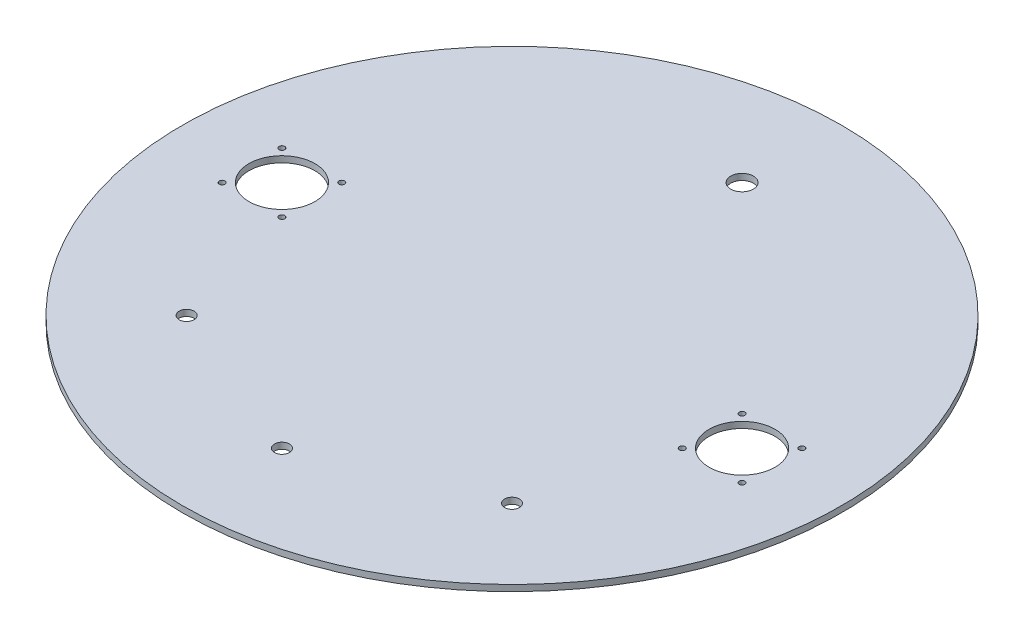
ISO-10303-21;
HEADER;
FILE_DESCRIPTION(('STEP AP214'),'2;1');
FILE_NAME('part.step','',(''),(''),'','','');
FILE_SCHEMA(('AUTOMOTIVE_DESIGN { 1 0 10303 214 1 1 1 1 }'));
ENDSEC;
DATA;
#1=APPLICATION_CONTEXT('core data for automotive mechanical design processes');
#2=APPLICATION_PROTOCOL_DEFINITION('international standard','automotive_design',2000,#1);
#3=PRODUCT_CONTEXT('',#1,'mechanical');
#4=PRODUCT('Part','Part','',(#3));
#5=PRODUCT_RELATED_PRODUCT_CATEGORY('part','',(#4));
#6=PRODUCT_DEFINITION_FORMATION('','',#4);
#7=PRODUCT_DEFINITION_CONTEXT('part definition',#1,'design');
#8=PRODUCT_DEFINITION('design','',#6,#7);
#9=PRODUCT_DEFINITION_SHAPE('','',#8);
#10=(LENGTH_UNIT() NAMED_UNIT(*) SI_UNIT(.MILLI.,.METRE.));
#11=(NAMED_UNIT(*) PLANE_ANGLE_UNIT() SI_UNIT($,.RADIAN.));
#12=(NAMED_UNIT(*) SI_UNIT($,.STERADIAN.) SOLID_ANGLE_UNIT());
#13=UNCERTAINTY_MEASURE_WITH_UNIT(LENGTH_MEASURE(1.E-05),#10,'distance_accuracy_value','');
#14=(GEOMETRIC_REPRESENTATION_CONTEXT(3) GLOBAL_UNCERTAINTY_ASSIGNED_CONTEXT((#13)) GLOBAL_UNIT_ASSIGNED_CONTEXT((#10,
#11,#12)) REPRESENTATION_CONTEXT('',''));
#15=CARTESIAN_POINT('',(0.,0.,0.));
#16=DIRECTION('',(0.,0.,1.));
#17=DIRECTION('',(1.,0.,0.));
#18=AXIS2_PLACEMENT_3D('',#15,#16,#17);
#19=CARTESIAN_POINT('',(-130.814754519513,2.5,130.81475451951));
#20=DIRECTION('',(0.,-1.,0.));
#21=DIRECTION('',(0.,0.,-1.));
#22=AXIS2_PLACEMENT_3D('',#19,#20,#21);
#23=CYLINDRICAL_SURFACE('',#22,6.00000000000046);
#24=CARTESIAN_POINT('',(-130.814754519513,2.5,130.81475451951));
#25=DIRECTION('',(0.,1.,0.));
#26=DIRECTION('',(0.,0.,1.));
#27=AXIS2_PLACEMENT_3D('',#24,#25,#26);
#28=CIRCLE('',#27,6.00000000000046);
#29=CARTESIAN_POINT('',(-130.814754519513,2.5,136.81475451951));
#30=VERTEX_POINT('',#29);
#31=EDGE_CURVE('E41',#30,#30,#28,.T.);
#32=ORIENTED_EDGE('',*,*,#31,.T.);
#33=EDGE_LOOP('',(#32));
#34=FACE_BOUND('',#33,.T.);
#35=CARTESIAN_POINT('',(-130.814754519513,-2.5,130.81475451951));
#36=DIRECTION('',(0.,1.,0.));
#37=DIRECTION('',(0.,0.,1.));
#38=AXIS2_PLACEMENT_3D('',#35,#36,#37);
#39=CIRCLE('',#38,6.00000000000046);
#40=CARTESIAN_POINT('',(-130.814754519513,-2.5,136.81475451951));
#41=VERTEX_POINT('',#40);
#42=EDGE_CURVE('E88',#41,#41,#39,.T.);
#43=ORIENTED_EDGE('',*,*,#42,.F.);
#44=EDGE_LOOP('',(#43));
#45=FACE_BOUND('',#44,.T.);
#46=ADVANCED_FACE('F33',(#34,#45),#23,.F.);
#47=CARTESIAN_POINT('',(0.,2.5,-185.));
#48=DIRECTION('',(0.,-1.,0.));
#49=DIRECTION('',(0.,0.,-1.));
#50=AXIS2_PLACEMENT_3D('',#47,#48,#49);
#51=CYLINDRICAL_SURFACE('',#50,9.10000000000001);
#52=CARTESIAN_POINT('',(0.,2.5,-185.));
#53=DIRECTION('',(0.,1.,0.));
#54=DIRECTION('',(0.,0.,1.));
#55=AXIS2_PLACEMENT_3D('',#52,#53,#54);
#56=CIRCLE('',#55,9.10000000000001);
#57=CARTESIAN_POINT('',(0.,2.5,-175.9));
#58=VERTEX_POINT('',#57);
#59=EDGE_CURVE('E46',#58,#58,#56,.T.);
#60=ORIENTED_EDGE('',*,*,#59,.T.);
#61=EDGE_LOOP('',(#60));
#62=FACE_BOUND('',#61,.T.);
#63=CARTESIAN_POINT('',(0.,-2.5,-185.));
#64=DIRECTION('',(0.,1.,0.));
#65=DIRECTION('',(0.,0.,1.));
#66=AXIS2_PLACEMENT_3D('',#63,#64,#65);
#67=CIRCLE('',#66,9.10000000000001);
#68=CARTESIAN_POINT('',(0.,-2.5,-175.9));
#69=VERTEX_POINT('',#68);
#70=EDGE_CURVE('E86',#69,#69,#67,.T.);
#71=ORIENTED_EDGE('',*,*,#70,.F.);
#72=EDGE_LOOP('',(#71));
#73=FACE_BOUND('',#72,.T.);
#74=ADVANCED_FACE('F136',(#62,#73),#51,.F.);
#75=CARTESIAN_POINT('',(160.95,2.5,24.05));
#76=DIRECTION('',(0.,-1.,0.));
#77=DIRECTION('',(0.,0.,-1.));
#78=AXIS2_PLACEMENT_3D('',#75,#76,#77);
#79=CYLINDRICAL_SURFACE('',#78,2.29999999999988);
#80=CARTESIAN_POINT('',(160.95,2.5,24.05));
#81=DIRECTION('',(0.,1.,0.));
#82=DIRECTION('',(0.,0.,1.));
#83=AXIS2_PLACEMENT_3D('',#80,#81,#82);
#84=CIRCLE('',#83,2.29999999999988);
#85=CARTESIAN_POINT('',(160.95,2.5,26.3499999999999));
#86=VERTEX_POINT('',#85);
#87=EDGE_CURVE('E131',#86,#86,#84,.F.);
#88=ORIENTED_EDGE('',*,*,#87,.F.);
#89=EDGE_LOOP('',(#88));
#90=FACE_BOUND('',#89,.T.);
#91=CARTESIAN_POINT('',(160.95,-2.5,24.05));
#92=DIRECTION('',(0.,1.,0.));
#93=DIRECTION('',(0.,0.,1.));
#94=AXIS2_PLACEMENT_3D('',#91,#92,#93);
#95=CIRCLE('',#94,2.29999999999988);
#96=CARTESIAN_POINT('',(160.95,-2.5,26.3499999999999));
#97=VERTEX_POINT('',#96);
#98=EDGE_CURVE('E83',#97,#97,#95,.F.);
#99=ORIENTED_EDGE('',*,*,#98,.T.);
#100=EDGE_LOOP('',(#99));
#101=FACE_BOUND('',#100,.T.);
#102=ADVANCED_FACE('F154',(#90,#101),#79,.F.);
#103=CARTESIAN_POINT('',(209.05,2.5,24.05));
#104=DIRECTION('',(0.,-1.,0.));
#105=DIRECTION('',(0.,0.,-1.));
#106=AXIS2_PLACEMENT_3D('',#103,#104,#105);
#107=CYLINDRICAL_SURFACE('',#106,2.29999999999998);
#108=CARTESIAN_POINT('',(209.05,2.5,24.05));
#109=DIRECTION('',(0.,1.,0.));
#110=DIRECTION('',(0.,0.,1.));
#111=AXIS2_PLACEMENT_3D('',#108,#109,#110);
#112=CIRCLE('',#111,2.29999999999998);
#113=CARTESIAN_POINT('',(209.05,2.5,26.35));
#114=VERTEX_POINT('',#113);
#115=EDGE_CURVE('E128',#114,#114,#112,.T.);
#116=ORIENTED_EDGE('',*,*,#115,.T.);
#117=EDGE_LOOP('',(#116));
#118=FACE_BOUND('',#117,.T.);
#119=CARTESIAN_POINT('',(209.05,-2.5,24.05));
#120=DIRECTION('',(0.,1.,0.));
#121=DIRECTION('',(0.,0.,1.));
#122=AXIS2_PLACEMENT_3D('',#119,#120,#121);
#123=CIRCLE('',#122,2.29999999999998);
#124=CARTESIAN_POINT('',(209.05,-2.5,26.35));
#125=VERTEX_POINT('',#124);
#126=EDGE_CURVE('E80',#125,#125,#123,.T.);
#127=ORIENTED_EDGE('',*,*,#126,.F.);
#128=EDGE_LOOP('',(#127));
#129=FACE_BOUND('',#128,.T.);
#130=ADVANCED_FACE('F161',(#118,#129),#107,.F.);
#131=CARTESIAN_POINT('',(-160.95,2.5,-24.05));
#132=DIRECTION('',(0.,-1.,0.));
#133=DIRECTION('',(0.,0.,-1.));
#134=AXIS2_PLACEMENT_3D('',#131,#132,#133);
#135=CYLINDRICAL_SURFACE('',#134,2.30000000000001);
#136=CARTESIAN_POINT('',(-160.95,2.5,-24.05));
#137=DIRECTION('',(0.,1.,0.));
#138=DIRECTION('',(0.,0.,1.));
#139=AXIS2_PLACEMENT_3D('',#136,#137,#138);
#140=CIRCLE('',#139,2.30000000000001);
#141=CARTESIAN_POINT('',(-160.95,2.5,-21.75));
#142=VERTEX_POINT('',#141);
#143=EDGE_CURVE('E125',#142,#142,#140,.F.);
#144=ORIENTED_EDGE('',*,*,#143,.F.);
#145=EDGE_LOOP('',(#144));
#146=FACE_BOUND('',#145,.T.);
#147=CARTESIAN_POINT('',(-160.95,-2.5,-24.05));
#148=DIRECTION('',(0.,1.,0.));
#149=DIRECTION('',(0.,0.,1.));
#150=AXIS2_PLACEMENT_3D('',#147,#148,#149);
#151=CIRCLE('',#150,2.30000000000001);
#152=CARTESIAN_POINT('',(-160.95,-2.5,-21.75));
#153=VERTEX_POINT('',#152);
#154=EDGE_CURVE('E77',#153,#153,#151,.F.);
#155=ORIENTED_EDGE('',*,*,#154,.T.);
#156=EDGE_LOOP('',(#155));
#157=FACE_BOUND('',#156,.T.);
#158=ADVANCED_FACE('F165',(#146,#157),#135,.F.);
#159=CARTESIAN_POINT('',(-209.05,2.5,-24.05));
#160=DIRECTION('',(0.,-1.,0.));
#161=DIRECTION('',(0.,0.,-1.));
#162=AXIS2_PLACEMENT_3D('',#159,#160,#161);
#163=CYLINDRICAL_SURFACE('',#162,2.30000000000001);
#164=CARTESIAN_POINT('',(-209.05,2.5,-24.05));
#165=DIRECTION('',(0.,1.,0.));
#166=DIRECTION('',(0.,0.,1.));
#167=AXIS2_PLACEMENT_3D('',#164,#165,#166);
#168=CIRCLE('',#167,2.30000000000001);
#169=CARTESIAN_POINT('',(-209.05,2.5,-21.75));
#170=VERTEX_POINT('',#169);
#171=EDGE_CURVE('E122',#170,#170,#168,.T.);
#172=ORIENTED_EDGE('',*,*,#171,.T.);
#173=EDGE_LOOP('',(#172));
#174=FACE_BOUND('',#173,.T.);
#175=CARTESIAN_POINT('',(-209.05,-2.5,-24.05));
#176=DIRECTION('',(0.,1.,0.));
#177=DIRECTION('',(0.,0.,1.));
#178=AXIS2_PLACEMENT_3D('',#175,#176,#177);
#179=CIRCLE('',#178,2.30000000000001);
#180=CARTESIAN_POINT('',(-209.05,-2.5,-21.75));
#181=VERTEX_POINT('',#180);
#182=EDGE_CURVE('E74',#181,#181,#179,.T.);
#183=ORIENTED_EDGE('',*,*,#182,.F.);
#184=EDGE_LOOP('',(#183));
#185=FACE_BOUND('',#184,.T.);
#186=ADVANCED_FACE('F169',(#174,#185),#163,.F.);
#187=CARTESIAN_POINT('',(0.,2.5,0.));
#188=DIRECTION('',(0.,-1.,0.));
#189=DIRECTION('',(0.,0.,-1.));
#190=AXIS2_PLACEMENT_3D('',#187,#188,#189);
#191=CYLINDRICAL_SURFACE('',#190,265.);
#192=CARTESIAN_POINT('',(0.,2.5,0.));
#193=DIRECTION('',(0.,1.,0.));
#194=DIRECTION('',(0.,0.,1.));
#195=AXIS2_PLACEMENT_3D('',#192,#193,#194);
#196=CIRCLE('',#195,265.);
#197=CARTESIAN_POINT('',(0.,2.5,265.));
#198=VERTEX_POINT('',#197);
#199=EDGE_CURVE('E119',#198,#198,#196,.T.);
#200=ORIENTED_EDGE('',*,*,#199,.F.);
#201=EDGE_LOOP('',(#200));
#202=FACE_BOUND('',#201,.T.);
#203=CARTESIAN_POINT('',(0.,-2.5,0.));
#204=DIRECTION('',(0.,1.,0.));
#205=DIRECTION('',(0.,0.,1.));
#206=AXIS2_PLACEMENT_3D('',#203,#204,#205);
#207=CIRCLE('',#206,265.);
#208=CARTESIAN_POINT('',(0.,-2.5,265.));
#209=VERTEX_POINT('',#208);
#210=EDGE_CURVE('E71',#209,#209,#207,.T.);
#211=ORIENTED_EDGE('',*,*,#210,.T.);
#212=EDGE_LOOP('',(#211));
#213=FACE_BOUND('',#212,.T.);
#214=ADVANCED_FACE('F173',(#202,#213),#191,.T.);
#215=CARTESIAN_POINT('',(-185.,2.5,0.));
#216=DIRECTION('',(0.,-1.,0.));
#217=DIRECTION('',(0.,0.,-1.));
#218=AXIS2_PLACEMENT_3D('',#215,#216,#217);
#219=CYLINDRICAL_SURFACE('',#218,26.5);
#220=CARTESIAN_POINT('',(-185.,2.5,0.));
#221=DIRECTION('',(0.,1.,0.));
#222=DIRECTION('',(0.,0.,1.));
#223=AXIS2_PLACEMENT_3D('',#220,#221,#222);
#224=CIRCLE('',#223,26.5);
#225=CARTESIAN_POINT('',(-185.,2.5,26.5));
#226=VERTEX_POINT('',#225);
#227=EDGE_CURVE('E116',#226,#226,#224,.T.);
#228=ORIENTED_EDGE('',*,*,#227,.T.);
#229=EDGE_LOOP('',(#228));
#230=FACE_BOUND('',#229,.T.);
#231=CARTESIAN_POINT('',(-185.,-2.5,0.));
#232=DIRECTION('',(0.,1.,0.));
#233=DIRECTION('',(0.,0.,1.));
#234=AXIS2_PLACEMENT_3D('',#231,#232,#233);
#235=CIRCLE('',#234,26.5);
#236=CARTESIAN_POINT('',(-185.,-2.5,26.5));
#237=VERTEX_POINT('',#236);
#238=EDGE_CURVE('E68',#237,#237,#235,.T.);
#239=ORIENTED_EDGE('',*,*,#238,.F.);
#240=EDGE_LOOP('',(#239));
#241=FACE_BOUND('',#240,.T.);
#242=ADVANCED_FACE('F177',(#230,#241),#219,.F.);
#243=CARTESIAN_POINT('',(185.,2.5,0.));
#244=DIRECTION('',(0.,-1.,0.));
#245=DIRECTION('',(0.,0.,-1.));
#246=AXIS2_PLACEMENT_3D('',#243,#244,#245);
#247=CYLINDRICAL_SURFACE('',#246,26.5);
#248=CARTESIAN_POINT('',(185.,2.5,0.));
#249=DIRECTION('',(0.,1.,0.));
#250=DIRECTION('',(0.,0.,1.));
#251=AXIS2_PLACEMENT_3D('',#248,#249,#250);
#252=CIRCLE('',#251,26.5);
#253=CARTESIAN_POINT('',(185.,2.5,26.5));
#254=VERTEX_POINT('',#253);
#255=EDGE_CURVE('E113',#254,#254,#252,.F.);
#256=ORIENTED_EDGE('',*,*,#255,.F.);
#257=EDGE_LOOP('',(#256));
#258=FACE_BOUND('',#257,.T.);
#259=CARTESIAN_POINT('',(185.,-2.5,0.));
#260=DIRECTION('',(0.,1.,0.));
#261=DIRECTION('',(0.,0.,1.));
#262=AXIS2_PLACEMENT_3D('',#259,#260,#261);
#263=CIRCLE('',#262,26.5);
#264=CARTESIAN_POINT('',(185.,-2.5,26.5));
#265=VERTEX_POINT('',#264);
#266=EDGE_CURVE('E65',#265,#265,#263,.F.);
#267=ORIENTED_EDGE('',*,*,#266,.T.);
#268=EDGE_LOOP('',(#267));
#269=FACE_BOUND('',#268,.T.);
#270=ADVANCED_FACE('F181',(#258,#269),#247,.F.);
#271=CARTESIAN_POINT('',(-160.95,2.5,24.05));
#272=DIRECTION('',(0.,-1.,0.));
#273=DIRECTION('',(0.,0.,-1.));
#274=AXIS2_PLACEMENT_3D('',#271,#272,#273);
#275=CYLINDRICAL_SURFACE('',#274,2.29999999999988);
#276=CARTESIAN_POINT('',(-160.95,2.5,24.05));
#277=DIRECTION('',(0.,1.,0.));
#278=DIRECTION('',(0.,0.,1.));
#279=AXIS2_PLACEMENT_3D('',#276,#277,#278);
#280=CIRCLE('',#279,2.29999999999988);
#281=CARTESIAN_POINT('',(-160.95,2.5,26.3499999999999));
#282=VERTEX_POINT('',#281);
#283=EDGE_CURVE('E110',#282,#282,#280,.T.);
#284=ORIENTED_EDGE('',*,*,#283,.T.);
#285=EDGE_LOOP('',(#284));
#286=FACE_BOUND('',#285,.T.);
#287=CARTESIAN_POINT('',(-160.95,-2.5,24.05));
#288=DIRECTION('',(0.,1.,0.));
#289=DIRECTION('',(0.,0.,1.));
#290=AXIS2_PLACEMENT_3D('',#287,#288,#289);
#291=CIRCLE('',#290,2.29999999999988);
#292=CARTESIAN_POINT('',(-160.95,-2.5,26.3499999999999));
#293=VERTEX_POINT('',#292);
#294=EDGE_CURVE('E62',#293,#293,#291,.T.);
#295=ORIENTED_EDGE('',*,*,#294,.F.);
#296=EDGE_LOOP('',(#295));
#297=FACE_BOUND('',#296,.T.);
#298=ADVANCED_FACE('F185',(#286,#297),#275,.F.);
#299=CARTESIAN_POINT('',(-209.05,2.5,24.05));
#300=DIRECTION('',(0.,-1.,0.));
#301=DIRECTION('',(0.,0.,-1.));
#302=AXIS2_PLACEMENT_3D('',#299,#300,#301);
#303=CYLINDRICAL_SURFACE('',#302,2.29999999999998);
#304=CARTESIAN_POINT('',(-209.05,2.5,24.05));
#305=DIRECTION('',(0.,1.,0.));
#306=DIRECTION('',(0.,0.,1.));
#307=AXIS2_PLACEMENT_3D('',#304,#305,#306);
#308=CIRCLE('',#307,2.29999999999998);
#309=CARTESIAN_POINT('',(-209.05,2.5,26.35));
#310=VERTEX_POINT('',#309);
#311=EDGE_CURVE('E107',#310,#310,#308,.F.);
#312=ORIENTED_EDGE('',*,*,#311,.F.);
#313=EDGE_LOOP('',(#312));
#314=FACE_BOUND('',#313,.T.);
#315=CARTESIAN_POINT('',(-209.05,-2.5,24.05));
#316=DIRECTION('',(0.,1.,0.));
#317=DIRECTION('',(0.,0.,1.));
#318=AXIS2_PLACEMENT_3D('',#315,#316,#317);
#319=CIRCLE('',#318,2.29999999999998);
#320=CARTESIAN_POINT('',(-209.05,-2.5,26.35));
#321=VERTEX_POINT('',#320);
#322=EDGE_CURVE('E59',#321,#321,#319,.F.);
#323=ORIENTED_EDGE('',*,*,#322,.T.);
#324=EDGE_LOOP('',(#323));
#325=FACE_BOUND('',#324,.T.);
#326=ADVANCED_FACE('F189',(#314,#325),#303,.F.);
#327=CARTESIAN_POINT('',(160.95,2.5,-24.05));
#328=DIRECTION('',(0.,-1.,0.));
#329=DIRECTION('',(0.,0.,-1.));
#330=AXIS2_PLACEMENT_3D('',#327,#328,#329);
#331=CYLINDRICAL_SURFACE('',#330,2.30000000000001);
#332=CARTESIAN_POINT('',(160.95,2.5,-24.05));
#333=DIRECTION('',(0.,1.,0.));
#334=DIRECTION('',(0.,0.,1.));
#335=AXIS2_PLACEMENT_3D('',#332,#333,#334);
#336=CIRCLE('',#335,2.30000000000001);
#337=CARTESIAN_POINT('',(160.95,2.5,-21.75));
#338=VERTEX_POINT('',#337);
#339=EDGE_CURVE('E102',#338,#338,#336,.T.);
#340=ORIENTED_EDGE('',*,*,#339,.T.);
#341=EDGE_LOOP('',(#340));
#342=FACE_BOUND('',#341,.T.);
#343=CARTESIAN_POINT('',(160.95,-2.5,-24.05));
#344=DIRECTION('',(0.,1.,0.));
#345=DIRECTION('',(0.,0.,1.));
#346=AXIS2_PLACEMENT_3D('',#343,#344,#345);
#347=CIRCLE('',#346,2.30000000000001);
#348=CARTESIAN_POINT('',(160.95,-2.5,-21.75));
#349=VERTEX_POINT('',#348);
#350=EDGE_CURVE('E56',#349,#349,#347,.T.);
#351=ORIENTED_EDGE('',*,*,#350,.F.);
#352=EDGE_LOOP('',(#351));
#353=FACE_BOUND('',#352,.T.);
#354=ADVANCED_FACE('F193',(#342,#353),#331,.F.);
#355=CARTESIAN_POINT('',(209.05,2.5,-24.05));
#356=DIRECTION('',(0.,-1.,0.));
#357=DIRECTION('',(0.,0.,-1.));
#358=AXIS2_PLACEMENT_3D('',#355,#356,#357);
#359=CYLINDRICAL_SURFACE('',#358,2.30000000000001);
#360=CARTESIAN_POINT('',(209.05,2.5,-24.05));
#361=DIRECTION('',(0.,1.,0.));
#362=DIRECTION('',(0.,0.,1.));
#363=AXIS2_PLACEMENT_3D('',#360,#361,#362);
#364=CIRCLE('',#363,2.30000000000001);
#365=CARTESIAN_POINT('',(209.05,2.5,-21.75));
#366=VERTEX_POINT('',#365);
#367=EDGE_CURVE('E97',#366,#366,#364,.F.);
#368=ORIENTED_EDGE('',*,*,#367,.F.);
#369=EDGE_LOOP('',(#368));
#370=FACE_BOUND('',#369,.T.);
#371=CARTESIAN_POINT('',(209.05,-2.5,-24.05));
#372=DIRECTION('',(0.,1.,0.));
#373=DIRECTION('',(0.,0.,1.));
#374=AXIS2_PLACEMENT_3D('',#371,#372,#373);
#375=CIRCLE('',#374,2.30000000000001);
#376=CARTESIAN_POINT('',(209.05,-2.5,-21.75));
#377=VERTEX_POINT('',#376);
#378=EDGE_CURVE('E53',#377,#377,#375,.F.);
#379=ORIENTED_EDGE('',*,*,#378,.T.);
#380=EDGE_LOOP('',(#379));
#381=FACE_BOUND('',#380,.T.);
#382=ADVANCED_FACE('F196',(#370,#381),#359,.F.);
#383=CARTESIAN_POINT('',(-6.38378239159465E-13,2.5,185.));
#384=DIRECTION('',(0.,-1.,0.));
#385=DIRECTION('',(0.,0.,-1.));
#386=AXIS2_PLACEMENT_3D('',#383,#384,#385);
#387=CYLINDRICAL_SURFACE('',#386,6.00000000000005);
#388=CARTESIAN_POINT('',(-6.38378239159465E-13,2.5,185.));
#389=DIRECTION('',(0.,1.,0.));
#390=DIRECTION('',(0.,0.,1.));
#391=AXIS2_PLACEMENT_3D('',#388,#389,#390);
#392=CIRCLE('',#391,6.00000000000005);
#393=CARTESIAN_POINT('',(-6.38378239159465E-13,2.5,191.));
#394=VERTEX_POINT('',#393);
#395=EDGE_CURVE('E93',#394,#394,#392,.T.);
#396=ORIENTED_EDGE('',*,*,#395,.T.);
#397=EDGE_LOOP('',(#396));
#398=FACE_BOUND('',#397,.T.);
#399=CARTESIAN_POINT('',(-6.38378239159465E-13,-2.5,185.));
#400=DIRECTION('',(0.,1.,0.));
#401=DIRECTION('',(0.,0.,1.));
#402=AXIS2_PLACEMENT_3D('',#399,#400,#401);
#403=CIRCLE('',#402,6.00000000000005);
#404=CARTESIAN_POINT('',(-6.38378239159465E-13,-2.5,191.));
#405=VERTEX_POINT('',#404);
#406=EDGE_CURVE('E50',#405,#405,#403,.T.);
#407=ORIENTED_EDGE('',*,*,#406,.F.);
#408=EDGE_LOOP('',(#407));
#409=FACE_BOUND('',#408,.T.);
#410=ADVANCED_FACE('F35',(#398,#409),#387,.F.);
#411=CARTESIAN_POINT('',(130.814754519512,2.5,130.814754519511));
#412=DIRECTION('',(0.,-1.,0.));
#413=DIRECTION('',(0.,0.,-1.));
#414=AXIS2_PLACEMENT_3D('',#411,#412,#413);
#415=CYLINDRICAL_SURFACE('',#414,6.00000000000002);
#416=CARTESIAN_POINT('',(130.814754519512,2.5,130.814754519511));
#417=DIRECTION('',(0.,1.,0.));
#418=DIRECTION('',(0.,0.,1.));
#419=AXIS2_PLACEMENT_3D('',#416,#417,#418);
#420=CIRCLE('',#419,6.00000000000002);
#421=CARTESIAN_POINT('',(130.814754519512,2.5,136.814754519511));
#422=VERTEX_POINT('',#421);
#423=EDGE_CURVE('E10',#422,#422,#420,.F.);
#424=ORIENTED_EDGE('',*,*,#423,.F.);
#425=EDGE_LOOP('',(#424));
#426=FACE_BOUND('',#425,.T.);
#427=CARTESIAN_POINT('',(130.814754519512,-2.5,130.814754519511));
#428=DIRECTION('',(0.,1.,0.));
#429=DIRECTION('',(0.,0.,1.));
#430=AXIS2_PLACEMENT_3D('',#427,#428,#429);
#431=CIRCLE('',#430,6.00000000000002);
#432=CARTESIAN_POINT('',(130.814754519512,-2.5,136.814754519511));
#433=VERTEX_POINT('',#432);
#434=EDGE_CURVE('E37',#433,#433,#431,.F.);
#435=ORIENTED_EDGE('',*,*,#434,.T.);
#436=EDGE_LOOP('',(#435));
#437=FACE_BOUND('',#436,.T.);
#438=ADVANCED_FACE('F143',(#426,#437),#415,.F.);
#439=CARTESIAN_POINT('',(0.,2.5,0.));
#440=DIRECTION('',(0.,1.,0.));
#441=DIRECTION('',(0.,0.,1.));
#442=AXIS2_PLACEMENT_3D('',#439,#440,#441);
#443=PLANE('',#442);
#444=ORIENTED_EDGE('',*,*,#395,.F.);
#445=EDGE_LOOP('',(#444));
#446=FACE_BOUND('',#445,.T.);
#447=ORIENTED_EDGE('',*,*,#367,.T.);
#448=EDGE_LOOP('',(#447));
#449=FACE_BOUND('',#448,.T.);
#450=ORIENTED_EDGE('',*,*,#339,.F.);
#451=EDGE_LOOP('',(#450));
#452=FACE_BOUND('',#451,.T.);
#453=ORIENTED_EDGE('',*,*,#311,.T.);
#454=EDGE_LOOP('',(#453));
#455=FACE_BOUND('',#454,.T.);
#456=ORIENTED_EDGE('',*,*,#283,.F.);
#457=EDGE_LOOP('',(#456));
#458=FACE_BOUND('',#457,.T.);
#459=ORIENTED_EDGE('',*,*,#255,.T.);
#460=EDGE_LOOP('',(#459));
#461=FACE_BOUND('',#460,.T.);
#462=ORIENTED_EDGE('',*,*,#227,.F.);
#463=EDGE_LOOP('',(#462));
#464=FACE_BOUND('',#463,.T.);
#465=ORIENTED_EDGE('',*,*,#199,.T.);
#466=EDGE_LOOP('',(#465));
#467=FACE_BOUND('',#466,.T.);
#468=ORIENTED_EDGE('',*,*,#171,.F.);
#469=EDGE_LOOP('',(#468));
#470=FACE_BOUND('',#469,.T.);
#471=ORIENTED_EDGE('',*,*,#143,.T.);
#472=EDGE_LOOP('',(#471));
#473=FACE_BOUND('',#472,.T.);
#474=ORIENTED_EDGE('',*,*,#115,.F.);
#475=EDGE_LOOP('',(#474));
#476=FACE_BOUND('',#475,.T.);
#477=ORIENTED_EDGE('',*,*,#87,.T.);
#478=EDGE_LOOP('',(#477));
#479=FACE_BOUND('',#478,.T.);
#480=ORIENTED_EDGE('',*,*,#59,.F.);
#481=EDGE_LOOP('',(#480));
#482=FACE_BOUND('',#481,.T.);
#483=ORIENTED_EDGE('',*,*,#31,.F.);
#484=EDGE_LOOP('',(#483));
#485=FACE_BOUND('',#484,.T.);
#486=ORIENTED_EDGE('',*,*,#423,.T.);
#487=EDGE_LOOP('',(#486));
#488=FACE_BOUND('',#487,.T.);
#489=ADVANCED_FACE('F139',(#446,#449,#452,#455,#458,#461,#464,#467,#470,#473,#476,#479,#482,
#485,#488),#443,.T.);
#490=CARTESIAN_POINT('',(0.,-2.5,0.));
#491=DIRECTION('',(0.,1.,0.));
#492=DIRECTION('',(0.,0.,1.));
#493=AXIS2_PLACEMENT_3D('',#490,#491,#492);
#494=PLANE('',#493);
#495=ORIENTED_EDGE('',*,*,#406,.T.);
#496=EDGE_LOOP('',(#495));
#497=FACE_BOUND('',#496,.T.);
#498=ORIENTED_EDGE('',*,*,#378,.F.);
#499=EDGE_LOOP('',(#498));
#500=FACE_BOUND('',#499,.T.);
#501=ORIENTED_EDGE('',*,*,#350,.T.);
#502=EDGE_LOOP('',(#501));
#503=FACE_BOUND('',#502,.T.);
#504=ORIENTED_EDGE('',*,*,#322,.F.);
#505=EDGE_LOOP('',(#504));
#506=FACE_BOUND('',#505,.T.);
#507=ORIENTED_EDGE('',*,*,#294,.T.);
#508=EDGE_LOOP('',(#507));
#509=FACE_BOUND('',#508,.T.);
#510=ORIENTED_EDGE('',*,*,#266,.F.);
#511=EDGE_LOOP('',(#510));
#512=FACE_BOUND('',#511,.T.);
#513=ORIENTED_EDGE('',*,*,#238,.T.);
#514=EDGE_LOOP('',(#513));
#515=FACE_BOUND('',#514,.T.);
#516=ORIENTED_EDGE('',*,*,#210,.F.);
#517=EDGE_LOOP('',(#516));
#518=FACE_BOUND('',#517,.T.);
#519=ORIENTED_EDGE('',*,*,#182,.T.);
#520=EDGE_LOOP('',(#519));
#521=FACE_BOUND('',#520,.T.);
#522=ORIENTED_EDGE('',*,*,#154,.F.);
#523=EDGE_LOOP('',(#522));
#524=FACE_BOUND('',#523,.T.);
#525=ORIENTED_EDGE('',*,*,#126,.T.);
#526=EDGE_LOOP('',(#525));
#527=FACE_BOUND('',#526,.T.);
#528=ORIENTED_EDGE('',*,*,#98,.F.);
#529=EDGE_LOOP('',(#528));
#530=FACE_BOUND('',#529,.T.);
#531=ORIENTED_EDGE('',*,*,#70,.T.);
#532=EDGE_LOOP('',(#531));
#533=FACE_BOUND('',#532,.T.);
#534=ORIENTED_EDGE('',*,*,#42,.T.);
#535=EDGE_LOOP('',(#534));
#536=FACE_BOUND('',#535,.T.);
#537=ORIENTED_EDGE('',*,*,#434,.F.);
#538=EDGE_LOOP('',(#537));
#539=FACE_BOUND('',#538,.T.);
#540=ADVANCED_FACE('F142',(#497,#500,#503,#506,#509,#512,#515,#518,#521,#524,#527,#530,#533,
#536,#539),#494,.F.);
#541=CLOSED_SHELL('',(#46,#74,#102,#130,#158,#186,#214,#242,#270,#298,#326,#354,#382,#410,#438,
#489,#540));
#542=MANIFOLD_SOLID_BREP('B2',#541);
#543=ADVANCED_BREP_SHAPE_REPRESENTATION('',(#18,#542),#14);
#544=SHAPE_DEFINITION_REPRESENTATION(#9,#543);
ENDSEC;
END-ISO-10303-21;
